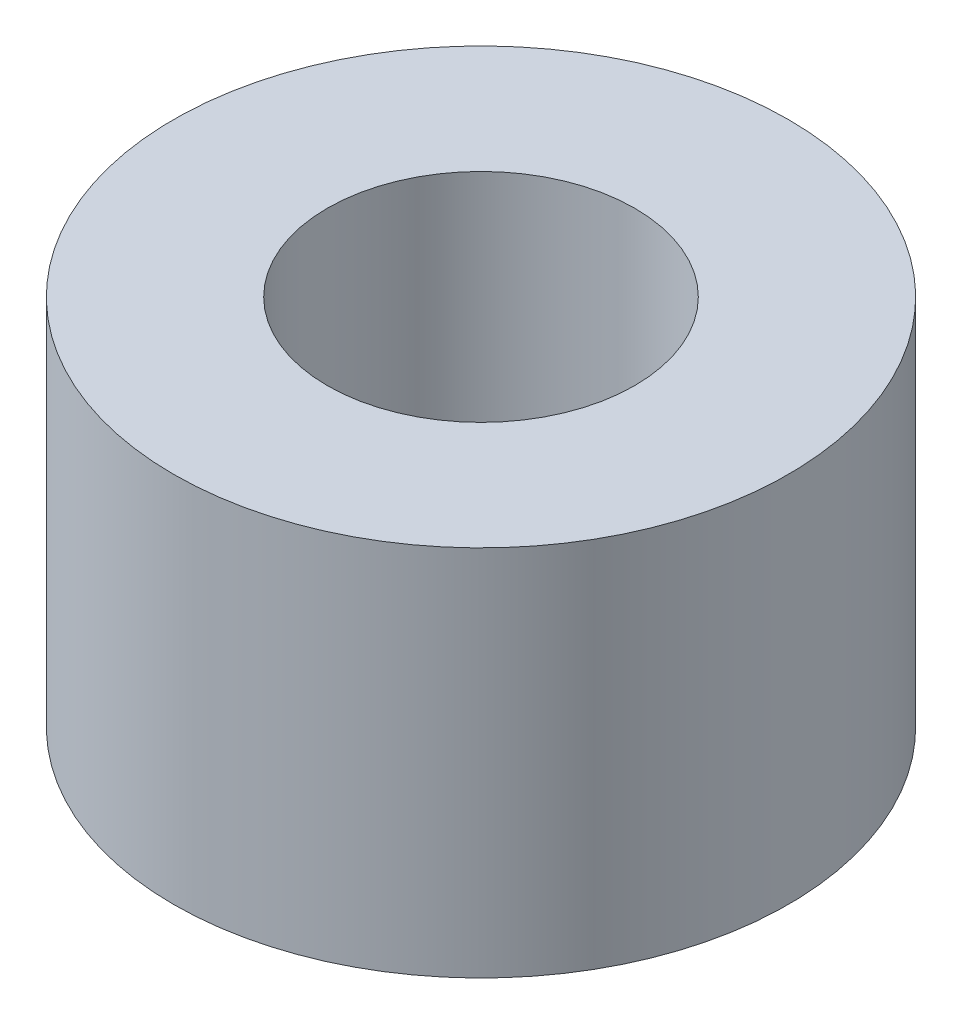
ISO-10303-21;
HEADER;
FILE_DESCRIPTION(('STEP AP214'),'2;1');
FILE_NAME('part.step','',(''),(''),'','','');
FILE_SCHEMA(('AUTOMOTIVE_DESIGN { 1 0 10303 214 1 1 1 1 }'));
ENDSEC;
DATA;
#1=APPLICATION_CONTEXT('core data for automotive mechanical design processes');
#2=APPLICATION_PROTOCOL_DEFINITION('international standard','automotive_design',2000,#1);
#3=PRODUCT_CONTEXT('',#1,'mechanical');
#4=PRODUCT('Part','Part','',(#3));
#5=PRODUCT_RELATED_PRODUCT_CATEGORY('part','',(#4));
#6=PRODUCT_DEFINITION_FORMATION('','',#4);
#7=PRODUCT_DEFINITION_CONTEXT('part definition',#1,'design');
#8=PRODUCT_DEFINITION('design','',#6,#7);
#9=PRODUCT_DEFINITION_SHAPE('','',#8);
#10=(LENGTH_UNIT() NAMED_UNIT(*) SI_UNIT(.MILLI.,.METRE.));
#11=(NAMED_UNIT(*) PLANE_ANGLE_UNIT() SI_UNIT($,.RADIAN.));
#12=(NAMED_UNIT(*) SI_UNIT($,.STERADIAN.) SOLID_ANGLE_UNIT());
#13=UNCERTAINTY_MEASURE_WITH_UNIT(LENGTH_MEASURE(1.E-05),#10,'distance_accuracy_value','');
#14=(GEOMETRIC_REPRESENTATION_CONTEXT(3) GLOBAL_UNCERTAINTY_ASSIGNED_CONTEXT((#13)) GLOBAL_UNIT_ASSIGNED_CONTEXT((#10,
#11,#12)) REPRESENTATION_CONTEXT('',''));
#15=CARTESIAN_POINT('',(0.,0.,0.));
#16=DIRECTION('',(0.,0.,1.));
#17=DIRECTION('',(1.,0.,0.));
#18=AXIS2_PLACEMENT_3D('',#15,#16,#17);
#19=CARTESIAN_POINT('',(0.,0.,0.));
#20=DIRECTION('',(0.,1.,0.));
#21=DIRECTION('',(0.,0.,1.));
#22=AXIS2_PLACEMENT_3D('',#19,#20,#21);
#23=CYLINDRICAL_SURFACE('',#22,2.5);
#24=CARTESIAN_POINT('',(0.,3.03,0.));
#25=DIRECTION('',(0.,1.,0.));
#26=DIRECTION('',(0.,0.,1.));
#27=AXIS2_PLACEMENT_3D('',#24,#25,#26);
#28=CIRCLE('',#27,2.5);
#29=CARTESIAN_POINT('',(0.,3.03,2.5));
#30=VERTEX_POINT('',#29);
#31=EDGE_CURVE('E52',#30,#30,#28,.T.);
#32=ORIENTED_EDGE('',*,*,#31,.F.);
#33=EDGE_LOOP('',(#32));
#34=FACE_BOUND('',#33,.T.);
#35=CARTESIAN_POINT('',(0.,0.,0.));
#36=DIRECTION('',(0.,1.,0.));
#37=DIRECTION('',(0.,0.,1.));
#38=AXIS2_PLACEMENT_3D('',#35,#36,#37);
#39=CIRCLE('',#38,2.5);
#40=CARTESIAN_POINT('',(0.,0.,2.5));
#41=VERTEX_POINT('',#40);
#42=EDGE_CURVE('E10',#41,#41,#39,.T.);
#43=ORIENTED_EDGE('',*,*,#42,.T.);
#44=EDGE_LOOP('',(#43));
#45=FACE_BOUND('',#44,.T.);
#46=ADVANCED_FACE('F45',(#34,#45),#23,.T.);
#47=CARTESIAN_POINT('',(0.,0.,0.));
#48=DIRECTION('',(0.,1.,0.));
#49=DIRECTION('',(0.,0.,1.));
#50=AXIS2_PLACEMENT_3D('',#47,#48,#49);
#51=PLANE('',#50);
#52=CARTESIAN_POINT('',(0.,0.,0.));
#53=DIRECTION('',(0.,1.,0.));
#54=DIRECTION('',(0.,0.,1.));
#55=AXIS2_PLACEMENT_3D('',#52,#53,#54);
#56=CIRCLE('',#55,1.25);
#57=CARTESIAN_POINT('',(0.,0.,1.25));
#58=VERTEX_POINT('',#57);
#59=EDGE_CURVE('E57',#58,#58,#56,.T.);
#60=ORIENTED_EDGE('',*,*,#59,.T.);
#61=EDGE_LOOP('',(#60));
#62=FACE_BOUND('',#61,.T.);
#63=ORIENTED_EDGE('',*,*,#42,.F.);
#64=EDGE_LOOP('',(#63));
#65=FACE_BOUND('',#64,.T.);
#66=ADVANCED_FACE('F74',(#62,#65),#51,.F.);
#67=CARTESIAN_POINT('',(0.,3.03,0.));
#68=DIRECTION('',(0.,-1.,0.));
#69=DIRECTION('',(0.,0.,-1.));
#70=AXIS2_PLACEMENT_3D('',#67,#68,#69);
#71=PLANE('',#70);
#72=CARTESIAN_POINT('',(0.,3.03,0.));
#73=DIRECTION('',(0.,1.,0.));
#74=DIRECTION('',(0.,0.,1.));
#75=AXIS2_PLACEMENT_3D('',#72,#73,#74);
#76=CIRCLE('',#75,1.25);
#77=CARTESIAN_POINT('',(0.,3.03,1.25));
#78=VERTEX_POINT('',#77);
#79=EDGE_CURVE('E62',#78,#78,#76,.T.);
#80=ORIENTED_EDGE('',*,*,#79,.F.);
#81=EDGE_LOOP('',(#80));
#82=FACE_BOUND('',#81,.T.);
#83=ORIENTED_EDGE('',*,*,#31,.T.);
#84=EDGE_LOOP('',(#83));
#85=FACE_BOUND('',#84,.T.);
#86=ADVANCED_FACE('F72',(#82,#85),#71,.F.);
#87=CARTESIAN_POINT('',(0.,3.03,0.));
#88=DIRECTION('',(0.,1.,0.));
#89=DIRECTION('',(0.,0.,1.));
#90=AXIS2_PLACEMENT_3D('',#87,#88,#89);
#91=CYLINDRICAL_SURFACE('',#90,1.25);
#92=ORIENTED_EDGE('',*,*,#79,.T.);
#93=EDGE_LOOP('',(#92));
#94=FACE_BOUND('',#93,.T.);
#95=ORIENTED_EDGE('',*,*,#59,.F.);
#96=EDGE_LOOP('',(#95));
#97=FACE_BOUND('',#96,.T.);
#98=ADVANCED_FACE('F69',(#94,#97),#91,.F.);
#99=CLOSED_SHELL('',(#46,#66,#86,#98));
#100=MANIFOLD_SOLID_BREP('B2',#99);
#101=ADVANCED_BREP_SHAPE_REPRESENTATION('',(#18,#100),#14);
#102=SHAPE_DEFINITION_REPRESENTATION(#9,#101);
ENDSEC;
END-ISO-10303-21;
